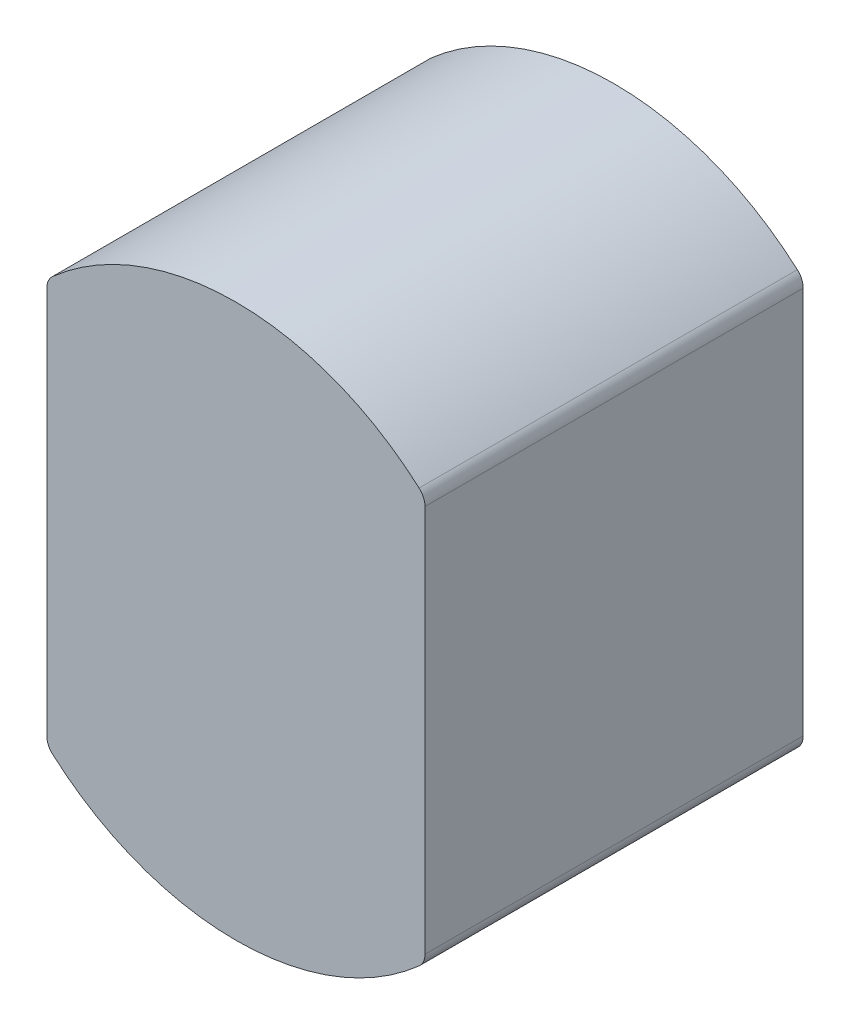
ISO-10303-21;
HEADER;
FILE_DESCRIPTION(('STEP AP214'),'2;1');
FILE_NAME('part.step','',(''),(''),'','','');
FILE_SCHEMA(('AUTOMOTIVE_DESIGN { 1 0 10303 214 1 1 1 1 }'));
ENDSEC;
DATA;
#1=APPLICATION_CONTEXT('core data for automotive mechanical design processes');
#2=APPLICATION_PROTOCOL_DEFINITION('international standard','automotive_design',2000,#1);
#3=PRODUCT_CONTEXT('',#1,'mechanical');
#4=PRODUCT('Part','Part','',(#3));
#5=PRODUCT_RELATED_PRODUCT_CATEGORY('part','',(#4));
#6=PRODUCT_DEFINITION_FORMATION('','',#4);
#7=PRODUCT_DEFINITION_CONTEXT('part definition',#1,'design');
#8=PRODUCT_DEFINITION('design','',#6,#7);
#9=PRODUCT_DEFINITION_SHAPE('','',#8);
#10=(LENGTH_UNIT() NAMED_UNIT(*) SI_UNIT(.MILLI.,.METRE.));
#11=(NAMED_UNIT(*) PLANE_ANGLE_UNIT() SI_UNIT($,.RADIAN.));
#12=(NAMED_UNIT(*) SI_UNIT($,.STERADIAN.) SOLID_ANGLE_UNIT());
#13=UNCERTAINTY_MEASURE_WITH_UNIT(LENGTH_MEASURE(1.E-05),#10,'distance_accuracy_value','');
#14=(GEOMETRIC_REPRESENTATION_CONTEXT(3) GLOBAL_UNCERTAINTY_ASSIGNED_CONTEXT((#13)) GLOBAL_UNIT_ASSIGNED_CONTEXT((#10,
#11,#12)) REPRESENTATION_CONTEXT('',''));
#15=CARTESIAN_POINT('',(0.,0.,0.));
#16=DIRECTION('',(0.,0.,1.));
#17=DIRECTION('',(1.,0.,0.));
#18=AXIS2_PLACEMENT_3D('',#15,#16,#17);
#19=CARTESIAN_POINT('',(0.,0.,65.));
#20=DIRECTION('',(0.,0.,-1.));
#21=DIRECTION('',(-1.,0.,0.));
#22=AXIS2_PLACEMENT_3D('',#19,#20,#21);
#23=CYLINDRICAL_SURFACE('',#22,47.5);
#24=CARTESIAN_POINT('',(0.,0.,65.));
#25=DIRECTION('',(0.,0.,1.));
#26=DIRECTION('',(1.,0.,0.));
#27=AXIS2_PLACEMENT_3D('',#24,#25,#26);
#28=CIRCLE('',#27,47.5);
#29=CARTESIAN_POINT('',(31.4887640449438,35.5627296326063,65.));
#30=VERTEX_POINT('',#29);
#31=CARTESIAN_POINT('',(-31.4887640449438,35.5627296326063,65.));
#32=VERTEX_POINT('',#31);
#33=EDGE_CURVE('E130',#30,#32,#28,.T.);
#34=ORIENTED_EDGE('',*,*,#33,.F.);
#35=DIRECTION('',(0.,0.,-1.));
#36=VECTOR('',#35,1.);
#37=CARTESIAN_POINT('',(31.4887640449438,35.5627296326063,65.));
#38=LINE('',#37,#36);
#39=CARTESIAN_POINT('',(31.4887640449438,35.5627296326063,0.));
#40=VERTEX_POINT('',#39);
#41=EDGE_CURVE('E156',#30,#40,#38,.T.);
#42=ORIENTED_EDGE('',*,*,#41,.T.);
#43=CARTESIAN_POINT('',(0.,0.,0.));
#44=DIRECTION('',(0.,0.,1.));
#45=DIRECTION('',(1.,0.,0.));
#46=AXIS2_PLACEMENT_3D('',#43,#44,#45);
#47=CIRCLE('',#46,47.5);
#48=CARTESIAN_POINT('',(-31.4887640449438,35.5627296326063,0.));
#49=VERTEX_POINT('',#48);
#50=EDGE_CURVE('E162',#40,#49,#47,.T.);
#51=ORIENTED_EDGE('',*,*,#50,.T.);
#52=DIRECTION('',(0.,0.,-1.));
#53=VECTOR('',#52,1.);
#54=CARTESIAN_POINT('',(-31.4887640449438,35.5627296326063,65.));
#55=LINE('',#54,#53);
#56=EDGE_CURVE('E154',#49,#32,#55,.F.);
#57=ORIENTED_EDGE('',*,*,#56,.T.);
#58=EDGE_LOOP('',(#34,#42,#51,#57));
#59=FACE_BOUND('',#58,.T.);
#60=ADVANCED_FACE('F38',(#59),#23,.T.);
#61=CARTESIAN_POINT('',(-32.5,0.,65.));
#62=DIRECTION('',(-1.,0.,0.));
#63=DIRECTION('',(0.,0.,1.));
#64=AXIS2_PLACEMENT_3D('',#61,#62,#63);
#65=PLANE('',#64);
#66=DIRECTION('',(0.,1.,0.));
#67=VECTOR('',#66,1.);
#68=CARTESIAN_POINT('',(-32.5,0.,65.));
#69=LINE('',#68,#67);
#70=CARTESIAN_POINT('',(-32.5,-33.3166624979154,65.));
#71=VERTEX_POINT('',#70);
#72=CARTESIAN_POINT('',(-32.5,33.3166624979154,65.));
#73=VERTEX_POINT('',#72);
#74=EDGE_CURVE('E133',#71,#73,#69,.T.);
#75=ORIENTED_EDGE('',*,*,#74,.T.);
#76=DIRECTION('',(0.,0.,1.));
#77=VECTOR('',#76,1.);
#78=CARTESIAN_POINT('',(-32.5,33.3166624979154,0.));
#79=LINE('',#78,#77);
#80=CARTESIAN_POINT('',(-32.5,33.3166624979154,0.));
#81=VERTEX_POINT('',#80);
#82=EDGE_CURVE('E11',#73,#81,#79,.F.);
#83=ORIENTED_EDGE('',*,*,#82,.T.);
#84=DIRECTION('',(0.,1.,0.));
#85=VECTOR('',#84,1.);
#86=CARTESIAN_POINT('',(-32.5,0.,0.));
#87=LINE('',#86,#85);
#88=CARTESIAN_POINT('',(-32.5,-33.3166624979154,0.));
#89=VERTEX_POINT('',#88);
#90=EDGE_CURVE('E135',#89,#81,#87,.T.);
#91=ORIENTED_EDGE('',*,*,#90,.F.);
#92=DIRECTION('',(0.,0.,1.));
#93=VECTOR('',#92,1.);
#94=CARTESIAN_POINT('',(-32.5,-33.3166624979154,65.));
#95=LINE('',#94,#93);
#96=EDGE_CURVE('E46',#89,#71,#95,.T.);
#97=ORIENTED_EDGE('',*,*,#96,.T.);
#98=EDGE_LOOP('',(#75,#83,#91,#97));
#99=FACE_BOUND('',#98,.T.);
#100=ADVANCED_FACE('F174',(#99),#65,.T.);
#101=CARTESIAN_POINT('',(0.,0.,65.));
#102=DIRECTION('',(0.,0.,-1.));
#103=DIRECTION('',(-1.,0.,0.));
#104=AXIS2_PLACEMENT_3D('',#101,#102,#103);
#105=CYLINDRICAL_SURFACE('',#104,47.5);
#106=CARTESIAN_POINT('',(0.,0.,0.));
#107=DIRECTION('',(0.,0.,1.));
#108=DIRECTION('',(1.,0.,0.));
#109=AXIS2_PLACEMENT_3D('',#106,#107,#108);
#110=CIRCLE('',#109,47.5);
#111=CARTESIAN_POINT('',(-31.4887640449438,-35.5627296326063,0.));
#112=VERTEX_POINT('',#111);
#113=CARTESIAN_POINT('',(31.4887640449438,-35.5627296326063,0.));
#114=VERTEX_POINT('',#113);
#115=EDGE_CURVE('E131',#112,#114,#110,.T.);
#116=ORIENTED_EDGE('',*,*,#115,.T.);
#117=DIRECTION('',(0.,0.,-1.));
#118=VECTOR('',#117,1.);
#119=CARTESIAN_POINT('',(31.4887640449438,-35.5627296326063,65.));
#120=LINE('',#119,#118);
#121=CARTESIAN_POINT('',(31.4887640449438,-35.5627296326063,65.));
#122=VERTEX_POINT('',#121);
#123=EDGE_CURVE('E109',#114,#122,#120,.F.);
#124=ORIENTED_EDGE('',*,*,#123,.T.);
#125=CARTESIAN_POINT('',(0.,0.,65.));
#126=DIRECTION('',(0.,0.,1.));
#127=DIRECTION('',(1.,0.,0.));
#128=AXIS2_PLACEMENT_3D('',#125,#126,#127);
#129=CIRCLE('',#128,47.5);
#130=CARTESIAN_POINT('',(-31.4887640449438,-35.5627296326063,65.));
#131=VERTEX_POINT('',#130);
#132=EDGE_CURVE('E170',#131,#122,#129,.T.);
#133=ORIENTED_EDGE('',*,*,#132,.F.);
#134=DIRECTION('',(0.,0.,-1.));
#135=VECTOR('',#134,1.);
#136=CARTESIAN_POINT('',(-31.4887640449438,-35.5627296326063,65.));
#137=LINE('',#136,#135);
#138=EDGE_CURVE('E114',#131,#112,#137,.T.);
#139=ORIENTED_EDGE('',*,*,#138,.T.);
#140=EDGE_LOOP('',(#116,#124,#133,#139));
#141=FACE_BOUND('',#140,.T.);
#142=ADVANCED_FACE('F192',(#141),#105,.T.);
#143=CARTESIAN_POINT('',(32.5,0.,65.));
#144=DIRECTION('',(-1.,0.,0.));
#145=DIRECTION('',(0.,0.,1.));
#146=AXIS2_PLACEMENT_3D('',#143,#144,#145);
#147=PLANE('',#146);
#148=DIRECTION('',(0.,1.,0.));
#149=VECTOR('',#148,1.);
#150=CARTESIAN_POINT('',(32.5,0.,65.));
#151=LINE('',#150,#149);
#152=CARTESIAN_POINT('',(32.5,-33.3166624979154,65.));
#153=VERTEX_POINT('',#152);
#154=CARTESIAN_POINT('',(32.5,33.3166624979154,65.));
#155=VERTEX_POINT('',#154);
#156=EDGE_CURVE('E124',#153,#155,#151,.T.);
#157=ORIENTED_EDGE('',*,*,#156,.F.);
#158=DIRECTION('',(0.,0.,-1.));
#159=VECTOR('',#158,1.);
#160=CARTESIAN_POINT('',(32.5,-33.3166624979154,65.));
#161=LINE('',#160,#159);
#162=CARTESIAN_POINT('',(32.5,-33.3166624979154,0.));
#163=VERTEX_POINT('',#162);
#164=EDGE_CURVE('E108',#153,#163,#161,.T.);
#165=ORIENTED_EDGE('',*,*,#164,.T.);
#166=DIRECTION('',(0.,1.,0.));
#167=VECTOR('',#166,1.);
#168=CARTESIAN_POINT('',(32.5,0.,0.));
#169=LINE('',#168,#167);
#170=CARTESIAN_POINT('',(32.5,33.3166624979154,0.));
#171=VERTEX_POINT('',#170);
#172=EDGE_CURVE('E121',#163,#171,#169,.T.);
#173=ORIENTED_EDGE('',*,*,#172,.T.);
#174=DIRECTION('',(0.,0.,-1.));
#175=VECTOR('',#174,1.);
#176=CARTESIAN_POINT('',(32.5,33.3166624979154,65.));
#177=LINE('',#176,#175);
#178=EDGE_CURVE('E126',#171,#155,#177,.F.);
#179=ORIENTED_EDGE('',*,*,#178,.T.);
#180=EDGE_LOOP('',(#157,#165,#173,#179));
#181=FACE_BOUND('',#180,.T.);
#182=ADVANCED_FACE('F120',(#181),#147,.F.);
#183=CARTESIAN_POINT('',(0.,0.,65.));
#184=DIRECTION('',(0.,0.,1.));
#185=DIRECTION('',(1.,0.,0.));
#186=AXIS2_PLACEMENT_3D('',#183,#184,#185);
#187=PLANE('',#186);
#188=ORIENTED_EDGE('',*,*,#132,.T.);
#189=CARTESIAN_POINT('',(29.5,-33.3166624979154,65.));
#190=DIRECTION('',(0.,0.,1.));
#191=DIRECTION('',(1.,0.,0.));
#192=AXIS2_PLACEMENT_3D('',#189,#190,#191);
#193=CIRCLE('',#192,3.);
#194=EDGE_CURVE('E152',#122,#153,#193,.T.);
#195=ORIENTED_EDGE('',*,*,#194,.T.);
#196=ORIENTED_EDGE('',*,*,#156,.T.);
#197=CARTESIAN_POINT('',(29.5,33.3166624979154,65.));
#198=DIRECTION('',(0.,0.,1.));
#199=DIRECTION('',(1.,0.,0.));
#200=AXIS2_PLACEMENT_3D('',#197,#198,#199);
#201=CIRCLE('',#200,3.);
#202=EDGE_CURVE('E150',#155,#30,#201,.T.);
#203=ORIENTED_EDGE('',*,*,#202,.T.);
#204=ORIENTED_EDGE('',*,*,#33,.T.);
#205=CARTESIAN_POINT('',(-29.5,33.3166624979154,65.));
#206=DIRECTION('',(0.,0.,1.));
#207=DIRECTION('',(1.,0.,0.));
#208=AXIS2_PLACEMENT_3D('',#205,#206,#207);
#209=CIRCLE('',#208,3.);
#210=EDGE_CURVE('E53',#32,#73,#209,.T.);
#211=ORIENTED_EDGE('',*,*,#210,.T.);
#212=ORIENTED_EDGE('',*,*,#74,.F.);
#213=CARTESIAN_POINT('',(-29.5,-33.3166624979154,65.));
#214=DIRECTION('',(0.,0.,1.));
#215=DIRECTION('',(1.,0.,0.));
#216=AXIS2_PLACEMENT_3D('',#213,#214,#215);
#217=CIRCLE('',#216,3.);
#218=EDGE_CURVE('E147',#71,#131,#217,.T.);
#219=ORIENTED_EDGE('',*,*,#218,.T.);
#220=EDGE_LOOP('',(#188,#195,#196,#203,#204,#211,#212,#219));
#221=FACE_BOUND('',#220,.T.);
#222=ADVANCED_FACE('F178',(#221),#187,.T.);
#223=CARTESIAN_POINT('',(0.,0.,0.));
#224=DIRECTION('',(0.,0.,1.));
#225=DIRECTION('',(1.,0.,0.));
#226=AXIS2_PLACEMENT_3D('',#223,#224,#225);
#227=PLANE('',#226);
#228=ORIENTED_EDGE('',*,*,#172,.F.);
#229=CARTESIAN_POINT('',(29.5,-33.3166624979154,0.));
#230=DIRECTION('',(0.,0.,1.));
#231=DIRECTION('',(1.,0.,0.));
#232=AXIS2_PLACEMENT_3D('',#229,#230,#231);
#233=CIRCLE('',#232,3.);
#234=EDGE_CURVE('E104',#163,#114,#233,.F.);
#235=ORIENTED_EDGE('',*,*,#234,.T.);
#236=ORIENTED_EDGE('',*,*,#115,.F.);
#237=CARTESIAN_POINT('',(-29.5,-33.3166624979154,0.));
#238=DIRECTION('',(0.,0.,1.));
#239=DIRECTION('',(1.,0.,0.));
#240=AXIS2_PLACEMENT_3D('',#237,#238,#239);
#241=CIRCLE('',#240,3.);
#242=EDGE_CURVE('E125',#112,#89,#241,.F.);
#243=ORIENTED_EDGE('',*,*,#242,.T.);
#244=ORIENTED_EDGE('',*,*,#90,.T.);
#245=CARTESIAN_POINT('',(-29.5,33.3166624979154,0.));
#246=DIRECTION('',(0.,0.,1.));
#247=DIRECTION('',(1.,0.,0.));
#248=AXIS2_PLACEMENT_3D('',#245,#246,#247);
#249=CIRCLE('',#248,3.);
#250=EDGE_CURVE('E141',#81,#49,#249,.F.);
#251=ORIENTED_EDGE('',*,*,#250,.T.);
#252=ORIENTED_EDGE('',*,*,#50,.F.);
#253=CARTESIAN_POINT('',(29.5,33.3166624979154,0.));
#254=DIRECTION('',(0.,0.,1.));
#255=DIRECTION('',(1.,0.,0.));
#256=AXIS2_PLACEMENT_3D('',#253,#254,#255);
#257=CIRCLE('',#256,3.);
#258=EDGE_CURVE('E115',#40,#171,#257,.F.);
#259=ORIENTED_EDGE('',*,*,#258,.T.);
#260=EDGE_LOOP('',(#228,#235,#236,#243,#244,#251,#252,#259));
#261=FACE_BOUND('',#260,.T.);
#262=ADVANCED_FACE('F128',(#261),#227,.F.);
#263=CARTESIAN_POINT('',(29.5,-33.3166624979154,65.));
#264=DIRECTION('',(0.,0.,-1.));
#265=DIRECTION('',(-1.,0.,0.));
#266=AXIS2_PLACEMENT_3D('',#263,#264,#265);
#267=CYLINDRICAL_SURFACE('',#266,3.);
#268=ORIENTED_EDGE('',*,*,#194,.F.);
#269=ORIENTED_EDGE('',*,*,#123,.F.);
#270=ORIENTED_EDGE('',*,*,#234,.F.);
#271=ORIENTED_EDGE('',*,*,#164,.F.);
#272=EDGE_LOOP('',(#268,#269,#270,#271));
#273=FACE_BOUND('',#272,.T.);
#274=ADVANCED_FACE('F107',(#273),#267,.T.);
#275=CARTESIAN_POINT('',(29.5,33.3166624979154,65.));
#276=DIRECTION('',(0.,0.,-1.));
#277=DIRECTION('',(-1.,0.,0.));
#278=AXIS2_PLACEMENT_3D('',#275,#276,#277);
#279=CYLINDRICAL_SURFACE('',#278,3.);
#280=ORIENTED_EDGE('',*,*,#202,.F.);
#281=ORIENTED_EDGE('',*,*,#178,.F.);
#282=ORIENTED_EDGE('',*,*,#258,.F.);
#283=ORIENTED_EDGE('',*,*,#41,.F.);
#284=EDGE_LOOP('',(#280,#281,#282,#283));
#285=FACE_BOUND('',#284,.T.);
#286=ADVANCED_FACE('F179',(#285),#279,.T.);
#287=CARTESIAN_POINT('',(-29.5,33.3166624979154,65.));
#288=DIRECTION('',(0.,0.,-1.));
#289=DIRECTION('',(-1.,0.,0.));
#290=AXIS2_PLACEMENT_3D('',#287,#288,#289);
#291=CYLINDRICAL_SURFACE('',#290,3.);
#292=ORIENTED_EDGE('',*,*,#210,.F.);
#293=ORIENTED_EDGE('',*,*,#56,.F.);
#294=ORIENTED_EDGE('',*,*,#250,.F.);
#295=ORIENTED_EDGE('',*,*,#82,.F.);
#296=EDGE_LOOP('',(#292,#293,#294,#295));
#297=FACE_BOUND('',#296,.T.);
#298=ADVANCED_FACE('F177',(#297),#291,.T.);
#299=CARTESIAN_POINT('',(-29.5,-33.3166624979154,65.));
#300=DIRECTION('',(0.,0.,-1.));
#301=DIRECTION('',(-1.,0.,0.));
#302=AXIS2_PLACEMENT_3D('',#299,#300,#301);
#303=CYLINDRICAL_SURFACE('',#302,3.);
#304=ORIENTED_EDGE('',*,*,#218,.F.);
#305=ORIENTED_EDGE('',*,*,#96,.F.);
#306=ORIENTED_EDGE('',*,*,#242,.F.);
#307=ORIENTED_EDGE('',*,*,#138,.F.);
#308=EDGE_LOOP('',(#304,#305,#306,#307));
#309=FACE_BOUND('',#308,.T.);
#310=ADVANCED_FACE('F40',(#309),#303,.T.);
#311=CLOSED_SHELL('',(#60,#100,#142,#182,#222,#262,#274,#286,#298,#310));
#312=MANIFOLD_SOLID_BREP('B2',#311);
#313=ADVANCED_BREP_SHAPE_REPRESENTATION('',(#18,#312),#14);
#314=SHAPE_DEFINITION_REPRESENTATION(#9,#313);
ENDSEC;
END-ISO-10303-21;
